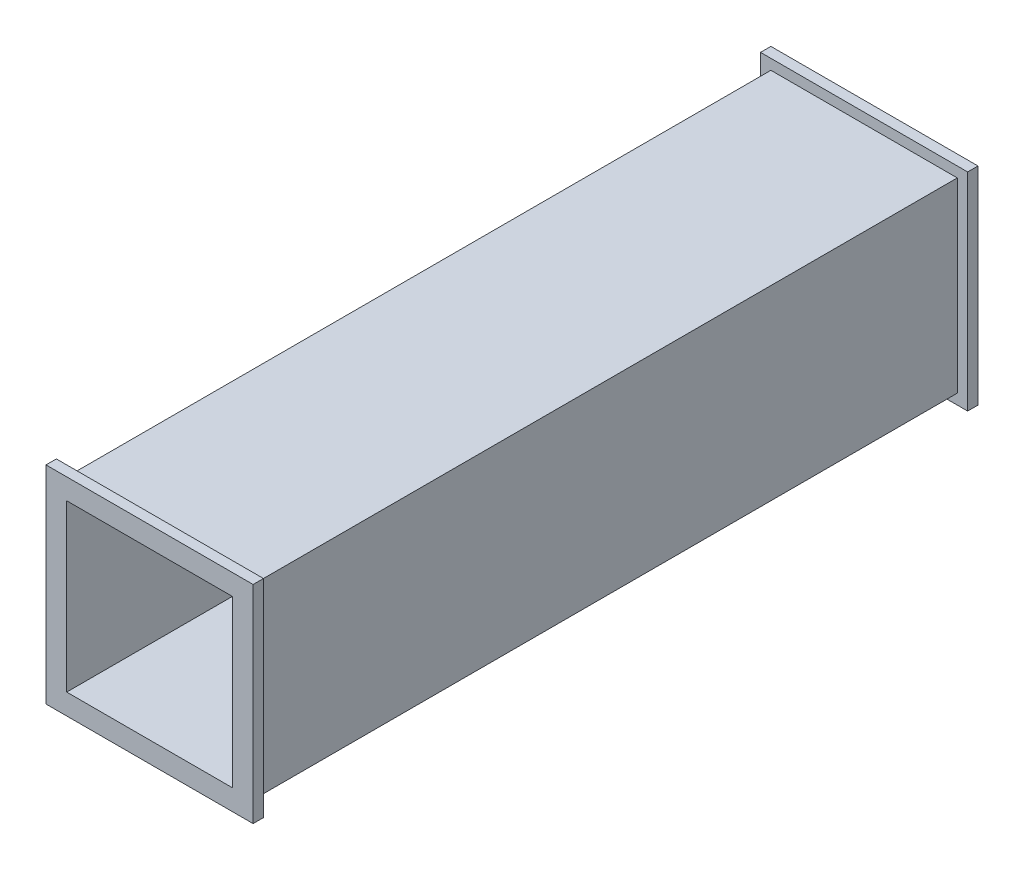
ISO-10303-21;
HEADER;
FILE_DESCRIPTION(('STEP AP214'),'2;1');
FILE_NAME('part.step','',(''),(''),'','','');
FILE_SCHEMA(('AUTOMOTIVE_DESIGN { 1 0 10303 214 1 1 1 1 }'));
ENDSEC;
DATA;
#1=APPLICATION_CONTEXT('core data for automotive mechanical design processes');
#2=APPLICATION_PROTOCOL_DEFINITION('international standard','automotive_design',2000,#1);
#3=PRODUCT_CONTEXT('',#1,'mechanical');
#4=PRODUCT('Part','Part','',(#3));
#5=PRODUCT_RELATED_PRODUCT_CATEGORY('part','',(#4));
#6=PRODUCT_DEFINITION_FORMATION('','',#4);
#7=PRODUCT_DEFINITION_CONTEXT('part definition',#1,'design');
#8=PRODUCT_DEFINITION('design','',#6,#7);
#9=PRODUCT_DEFINITION_SHAPE('','',#8);
#10=(LENGTH_UNIT() NAMED_UNIT(*) SI_UNIT(.MILLI.,.METRE.));
#11=(NAMED_UNIT(*) PLANE_ANGLE_UNIT() SI_UNIT($,.RADIAN.));
#12=(NAMED_UNIT(*) SI_UNIT($,.STERADIAN.) SOLID_ANGLE_UNIT());
#13=UNCERTAINTY_MEASURE_WITH_UNIT(LENGTH_MEASURE(1.E-05),#10,'distance_accuracy_value','');
#14=(GEOMETRIC_REPRESENTATION_CONTEXT(3) GLOBAL_UNCERTAINTY_ASSIGNED_CONTEXT((#13)) GLOBAL_UNIT_ASSIGNED_CONTEXT((#10,
#11,#12)) REPRESENTATION_CONTEXT('',''));
#15=CARTESIAN_POINT('',(0.,0.,0.));
#16=DIRECTION('',(0.,0.,1.));
#17=DIRECTION('',(1.,0.,0.));
#18=AXIS2_PLACEMENT_3D('',#15,#16,#17);
#19=CARTESIAN_POINT('',(45.,45.,350.));
#20=DIRECTION('',(-1.,0.,0.));
#21=DIRECTION('',(0.,-1.,0.));
#22=AXIS2_PLACEMENT_3D('',#19,#20,#21);
#23=PLANE('',#22);
#24=DIRECTION('',(0.,-1.,0.));
#25=VECTOR('',#24,1.);
#26=CARTESIAN_POINT('',(45.,45.,5.));
#27=LINE('',#26,#25);
#28=CARTESIAN_POINT('',(45.,45.,5.));
#29=VERTEX_POINT('',#28);
#30=CARTESIAN_POINT('',(45.,-45.,5.));
#31=VERTEX_POINT('',#30);
#32=EDGE_CURVE('E55',#29,#31,#27,.T.);
#33=ORIENTED_EDGE('',*,*,#32,.F.);
#34=DIRECTION('',(0.,0.,-1.));
#35=VECTOR('',#34,1.);
#36=CARTESIAN_POINT('',(45.,45.,350.));
#37=LINE('',#36,#35);
#38=CARTESIAN_POINT('',(45.,45.,345.));
#39=VERTEX_POINT('',#38);
#40=EDGE_CURVE('E327',#39,#29,#37,.T.);
#41=ORIENTED_EDGE('',*,*,#40,.F.);
#42=DIRECTION('',(0.,1.,0.));
#43=VECTOR('',#42,1.);
#44=CARTESIAN_POINT('',(45.,-45.,345.));
#45=LINE('',#44,#43);
#46=CARTESIAN_POINT('',(45.,-45.,345.));
#47=VERTEX_POINT('',#46);
#48=EDGE_CURVE('E234',#47,#39,#45,.T.);
#49=ORIENTED_EDGE('',*,*,#48,.F.);
#50=DIRECTION('',(0.,0.,-1.));
#51=VECTOR('',#50,1.);
#52=CARTESIAN_POINT('',(45.,-45.,350.));
#53=LINE('',#52,#51);
#54=EDGE_CURVE('E188',#47,#31,#53,.T.);
#55=ORIENTED_EDGE('',*,*,#54,.T.);
#56=EDGE_LOOP('',(#33,#41,#49,#55));
#57=FACE_BOUND('',#56,.T.);
#58=ADVANCED_FACE('F41',(#57),#23,.F.);
#59=CARTESIAN_POINT('',(-45.,45.,350.));
#60=DIRECTION('',(0.,-1.,0.));
#61=DIRECTION('',(0.,0.,-1.));
#62=AXIS2_PLACEMENT_3D('',#59,#60,#61);
#63=PLANE('',#62);
#64=DIRECTION('',(1.,0.,0.));
#65=VECTOR('',#64,1.);
#66=CARTESIAN_POINT('',(-45.,45.,5.));
#67=LINE('',#66,#65);
#68=CARTESIAN_POINT('',(-45.,45.,5.));
#69=VERTEX_POINT('',#68);
#70=EDGE_CURVE('E62',#69,#29,#67,.T.);
#71=ORIENTED_EDGE('',*,*,#70,.F.);
#72=DIRECTION('',(0.,0.,-1.));
#73=VECTOR('',#72,1.);
#74=CARTESIAN_POINT('',(-45.,45.,350.));
#75=LINE('',#74,#73);
#76=CARTESIAN_POINT('',(-45.,45.,345.));
#77=VERTEX_POINT('',#76);
#78=EDGE_CURVE('E187',#77,#69,#75,.T.);
#79=ORIENTED_EDGE('',*,*,#78,.F.);
#80=DIRECTION('',(-1.,0.,0.));
#81=VECTOR('',#80,1.);
#82=CARTESIAN_POINT('',(45.,45.,345.));
#83=LINE('',#82,#81);
#84=EDGE_CURVE('E237',#39,#77,#83,.T.);
#85=ORIENTED_EDGE('',*,*,#84,.F.);
#86=ORIENTED_EDGE('',*,*,#40,.T.);
#87=EDGE_LOOP('',(#71,#79,#85,#86));
#88=FACE_BOUND('',#87,.T.);
#89=ADVANCED_FACE('F357',(#88),#63,.F.);
#90=CARTESIAN_POINT('',(-45.,45.,350.));
#91=DIRECTION('',(1.,0.,0.));
#92=DIRECTION('',(0.,1.,0.));
#93=AXIS2_PLACEMENT_3D('',#90,#91,#92);
#94=PLANE('',#93);
#95=DIRECTION('',(0.,0.,-1.));
#96=VECTOR('',#95,1.);
#97=CARTESIAN_POINT('',(-45.,25.,125.));
#98=LINE('',#97,#96);
#99=CARTESIAN_POINT('',(-45.,25.,225.));
#100=VERTEX_POINT('',#99);
#101=CARTESIAN_POINT('',(-45.,25.,125.));
#102=VERTEX_POINT('',#101);
#103=EDGE_CURVE('E276',#100,#102,#98,.T.);
#104=ORIENTED_EDGE('',*,*,#103,.F.);
#105=DIRECTION('',(0.,1.,0.));
#106=VECTOR('',#105,1.);
#107=CARTESIAN_POINT('',(-45.,25.,225.));
#108=LINE('',#107,#106);
#109=CARTESIAN_POINT('',(-45.,-25.,225.));
#110=VERTEX_POINT('',#109);
#111=EDGE_CURVE('E269',#110,#100,#108,.T.);
#112=ORIENTED_EDGE('',*,*,#111,.F.);
#113=DIRECTION('',(0.,0.,1.));
#114=VECTOR('',#113,1.);
#115=CARTESIAN_POINT('',(-45.,-25.,125.));
#116=LINE('',#115,#114);
#117=CARTESIAN_POINT('',(-45.,-25.,125.));
#118=VERTEX_POINT('',#117);
#119=EDGE_CURVE('E282',#118,#110,#116,.T.);
#120=ORIENTED_EDGE('',*,*,#119,.F.);
#121=DIRECTION('',(0.,-1.,0.));
#122=VECTOR('',#121,1.);
#123=CARTESIAN_POINT('',(-45.,25.,125.));
#124=LINE('',#123,#122);
#125=EDGE_CURVE('E279',#102,#118,#124,.T.);
#126=ORIENTED_EDGE('',*,*,#125,.F.);
#127=EDGE_LOOP('',(#104,#112,#120,#126));
#128=FACE_BOUND('',#127,.T.);
#129=DIRECTION('',(0.,1.,0.));
#130=VECTOR('',#129,1.);
#131=CARTESIAN_POINT('',(-45.,-45.,5.));
#132=LINE('',#131,#130);
#133=CARTESIAN_POINT('',(-45.,-45.,5.));
#134=VERTEX_POINT('',#133);
#135=EDGE_CURVE('E191',#134,#69,#132,.T.);
#136=ORIENTED_EDGE('',*,*,#135,.F.);
#137=DIRECTION('',(0.,0.,-1.));
#138=VECTOR('',#137,1.);
#139=CARTESIAN_POINT('',(-45.,-45.,350.));
#140=LINE('',#139,#138);
#141=CARTESIAN_POINT('',(-45.,-45.,345.));
#142=VERTEX_POINT('',#141);
#143=EDGE_CURVE('E178',#142,#134,#140,.T.);
#144=ORIENTED_EDGE('',*,*,#143,.F.);
#145=DIRECTION('',(0.,-1.,0.));
#146=VECTOR('',#145,1.);
#147=CARTESIAN_POINT('',(-45.,45.,345.));
#148=LINE('',#147,#146);
#149=EDGE_CURVE('E240',#77,#142,#148,.T.);
#150=ORIENTED_EDGE('',*,*,#149,.F.);
#151=ORIENTED_EDGE('',*,*,#78,.T.);
#152=EDGE_LOOP('',(#136,#144,#150,#151));
#153=FACE_BOUND('',#152,.T.);
#154=ADVANCED_FACE('F192',(#128,#153),#94,.F.);
#155=CARTESIAN_POINT('',(-45.,-45.,350.));
#156=DIRECTION('',(0.,1.,0.));
#157=DIRECTION('',(0.,0.,1.));
#158=AXIS2_PLACEMENT_3D('',#155,#156,#157);
#159=PLANE('',#158);
#160=DIRECTION('',(-1.,0.,0.));
#161=VECTOR('',#160,1.);
#162=CARTESIAN_POINT('',(45.,-45.,5.));
#163=LINE('',#162,#161);
#164=EDGE_CURVE('E182',#31,#134,#163,.T.);
#165=ORIENTED_EDGE('',*,*,#164,.F.);
#166=ORIENTED_EDGE('',*,*,#54,.F.);
#167=DIRECTION('',(1.,0.,0.));
#168=VECTOR('',#167,1.);
#169=CARTESIAN_POINT('',(-45.,-45.,345.));
#170=LINE('',#169,#168);
#171=EDGE_CURVE('E184',#142,#47,#170,.T.);
#172=ORIENTED_EDGE('',*,*,#171,.F.);
#173=ORIENTED_EDGE('',*,*,#143,.T.);
#174=EDGE_LOOP('',(#165,#166,#172,#173));
#175=FACE_BOUND('',#174,.T.);
#176=ADVANCED_FACE('F180',(#175),#159,.F.);
#177=CARTESIAN_POINT('',(0.,0.,350.));
#178=DIRECTION('',(0.,0.,1.));
#179=DIRECTION('',(1.,0.,0.));
#180=AXIS2_PLACEMENT_3D('',#177,#178,#179);
#181=PLANE('',#180);
#182=DIRECTION('',(0.,1.,0.));
#183=VECTOR('',#182,1.);
#184=CARTESIAN_POINT('',(40.,45.,350.));
#185=LINE('',#184,#183);
#186=CARTESIAN_POINT('',(40.,-40.,350.));
#187=VERTEX_POINT('',#186);
#188=CARTESIAN_POINT('',(40.,40.,350.));
#189=VERTEX_POINT('',#188);
#190=EDGE_CURVE('E312',#187,#189,#185,.T.);
#191=ORIENTED_EDGE('',*,*,#190,.F.);
#192=DIRECTION('',(1.,0.,0.));
#193=VECTOR('',#192,1.);
#194=CARTESIAN_POINT('',(-45.,-40.,350.));
#195=LINE('',#194,#193);
#196=CARTESIAN_POINT('',(-40.,-40.,350.));
#197=VERTEX_POINT('',#196);
#198=EDGE_CURVE('E302',#197,#187,#195,.T.);
#199=ORIENTED_EDGE('',*,*,#198,.F.);
#200=DIRECTION('',(0.,-1.,0.));
#201=VECTOR('',#200,1.);
#202=CARTESIAN_POINT('',(-40.,45.,350.));
#203=LINE('',#202,#201);
#204=CARTESIAN_POINT('',(-40.,40.,350.));
#205=VERTEX_POINT('',#204);
#206=EDGE_CURVE('E321',#205,#197,#203,.T.);
#207=ORIENTED_EDGE('',*,*,#206,.F.);
#208=DIRECTION('',(-1.,0.,0.));
#209=VECTOR('',#208,1.);
#210=CARTESIAN_POINT('',(-45.,40.,350.));
#211=LINE('',#210,#209);
#212=EDGE_CURVE('E319',#189,#205,#211,.T.);
#213=ORIENTED_EDGE('',*,*,#212,.F.);
#214=EDGE_LOOP('',(#191,#199,#207,#213));
#215=FACE_BOUND('',#214,.T.);
#216=DIRECTION('',(0.,1.,0.));
#217=VECTOR('',#216,1.);
#218=CARTESIAN_POINT('',(50.,-50.,350.));
#219=LINE('',#218,#217);
#220=CARTESIAN_POINT('',(50.,-50.,350.));
#221=VERTEX_POINT('',#220);
#222=CARTESIAN_POINT('',(50.,50.,350.));
#223=VERTEX_POINT('',#222);
#224=EDGE_CURVE('E242',#221,#223,#219,.T.);
#225=ORIENTED_EDGE('',*,*,#224,.T.);
#226=DIRECTION('',(-1.,0.,0.));
#227=VECTOR('',#226,1.);
#228=CARTESIAN_POINT('',(50.,50.,350.));
#229=LINE('',#228,#227);
#230=CARTESIAN_POINT('',(-50.,50.,350.));
#231=VERTEX_POINT('',#230);
#232=EDGE_CURVE('E259',#223,#231,#229,.T.);
#233=ORIENTED_EDGE('',*,*,#232,.T.);
#234=DIRECTION('',(0.,-1.,0.));
#235=VECTOR('',#234,1.);
#236=CARTESIAN_POINT('',(-50.,50.,350.));
#237=LINE('',#236,#235);
#238=CARTESIAN_POINT('',(-50.,-50.,350.));
#239=VERTEX_POINT('',#238);
#240=EDGE_CURVE('E262',#231,#239,#237,.T.);
#241=ORIENTED_EDGE('',*,*,#240,.T.);
#242=DIRECTION('',(1.,0.,0.));
#243=VECTOR('',#242,1.);
#244=CARTESIAN_POINT('',(-50.,-50.,350.));
#245=LINE('',#244,#243);
#246=EDGE_CURVE('E247',#239,#221,#245,.T.);
#247=ORIENTED_EDGE('',*,*,#246,.T.);
#248=EDGE_LOOP('',(#225,#233,#241,#247));
#249=FACE_BOUND('',#248,.T.);
#250=ADVANCED_FACE('F363',(#215,#249),#181,.T.);
#251=CARTESIAN_POINT('',(0.,0.,0.));
#252=DIRECTION('',(0.,0.,1.));
#253=DIRECTION('',(1.,0.,0.));
#254=AXIS2_PLACEMENT_3D('',#251,#252,#253);
#255=PLANE('',#254);
#256=DIRECTION('',(1.,0.,0.));
#257=VECTOR('',#256,1.);
#258=CARTESIAN_POINT('',(-45.,-40.,0.));
#259=LINE('',#258,#257);
#260=CARTESIAN_POINT('',(-40.,-40.,0.));
#261=VERTEX_POINT('',#260);
#262=CARTESIAN_POINT('',(40.,-40.,0.));
#263=VERTEX_POINT('',#262);
#264=EDGE_CURVE('E309',#261,#263,#259,.T.);
#265=ORIENTED_EDGE('',*,*,#264,.T.);
#266=DIRECTION('',(0.,1.,0.));
#267=VECTOR('',#266,1.);
#268=CARTESIAN_POINT('',(40.,45.,0.));
#269=LINE('',#268,#267);
#270=CARTESIAN_POINT('',(40.,40.,0.));
#271=VERTEX_POINT('',#270);
#272=EDGE_CURVE('E288',#263,#271,#269,.T.);
#273=ORIENTED_EDGE('',*,*,#272,.T.);
#274=DIRECTION('',(-1.,0.,0.));
#275=VECTOR('',#274,1.);
#276=CARTESIAN_POINT('',(-45.,40.,0.));
#277=LINE('',#276,#275);
#278=CARTESIAN_POINT('',(-40.,40.,0.));
#279=VERTEX_POINT('',#278);
#280=EDGE_CURVE('E308',#271,#279,#277,.T.);
#281=ORIENTED_EDGE('',*,*,#280,.T.);
#282=DIRECTION('',(0.,-1.,0.));
#283=VECTOR('',#282,1.);
#284=CARTESIAN_POINT('',(-40.,45.,0.));
#285=LINE('',#284,#283);
#286=EDGE_CURVE('E313',#279,#261,#285,.T.);
#287=ORIENTED_EDGE('',*,*,#286,.T.);
#288=EDGE_LOOP('',(#265,#273,#281,#287));
#289=FACE_BOUND('',#288,.T.);
#290=DIRECTION('',(0.,1.,0.));
#291=VECTOR('',#290,1.);
#292=CARTESIAN_POINT('',(-50.,-50.,0.));
#293=LINE('',#292,#291);
#294=CARTESIAN_POINT('',(-50.,-50.,0.));
#295=VERTEX_POINT('',#294);
#296=CARTESIAN_POINT('',(-50.,50.,0.));
#297=VERTEX_POINT('',#296);
#298=EDGE_CURVE('E194',#295,#297,#293,.T.);
#299=ORIENTED_EDGE('',*,*,#298,.T.);
#300=DIRECTION('',(1.,0.,0.));
#301=VECTOR('',#300,1.);
#302=CARTESIAN_POINT('',(-50.,50.,0.));
#303=LINE('',#302,#301);
#304=CARTESIAN_POINT('',(50.,50.,0.));
#305=VERTEX_POINT('',#304);
#306=EDGE_CURVE('E218',#297,#305,#303,.T.);
#307=ORIENTED_EDGE('',*,*,#306,.T.);
#308=DIRECTION('',(0.,-1.,0.));
#309=VECTOR('',#308,1.);
#310=CARTESIAN_POINT('',(50.,50.,0.));
#311=LINE('',#310,#309);
#312=CARTESIAN_POINT('',(50.,-50.,0.));
#313=VERTEX_POINT('',#312);
#314=EDGE_CURVE('E221',#305,#313,#311,.T.);
#315=ORIENTED_EDGE('',*,*,#314,.T.);
#316=DIRECTION('',(-1.,0.,0.));
#317=VECTOR('',#316,1.);
#318=CARTESIAN_POINT('',(50.,-50.,0.));
#319=LINE('',#318,#317);
#320=EDGE_CURVE('E206',#313,#295,#319,.T.);
#321=ORIENTED_EDGE('',*,*,#320,.T.);
#322=EDGE_LOOP('',(#299,#307,#315,#321));
#323=FACE_BOUND('',#322,.T.);
#324=ADVANCED_FACE('F447',(#289,#323),#255,.F.);
#325=CARTESIAN_POINT('',(40.,45.,350.));
#326=DIRECTION('',(-1.,0.,0.));
#327=DIRECTION('',(0.,-1.,0.));
#328=AXIS2_PLACEMENT_3D('',#325,#326,#327);
#329=PLANE('',#328);
#330=ORIENTED_EDGE('',*,*,#272,.F.);
#331=DIRECTION('',(0.,0.,-1.));
#332=VECTOR('',#331,1.);
#333=CARTESIAN_POINT('',(40.,-40.,350.));
#334=LINE('',#333,#332);
#335=EDGE_CURVE('E299',#187,#263,#334,.T.);
#336=ORIENTED_EDGE('',*,*,#335,.F.);
#337=ORIENTED_EDGE('',*,*,#190,.T.);
#338=DIRECTION('',(0.,0.,-1.));
#339=VECTOR('',#338,1.);
#340=CARTESIAN_POINT('',(40.,40.,350.));
#341=LINE('',#340,#339);
#342=EDGE_CURVE('E295',#189,#271,#341,.T.);
#343=ORIENTED_EDGE('',*,*,#342,.T.);
#344=EDGE_LOOP('',(#330,#336,#337,#343));
#345=FACE_BOUND('',#344,.T.);
#346=ADVANCED_FACE('F514',(#345),#329,.T.);
#347=CARTESIAN_POINT('',(-45.,40.,350.));
#348=DIRECTION('',(0.,-1.,0.));
#349=DIRECTION('',(0.,0.,-1.));
#350=AXIS2_PLACEMENT_3D('',#347,#348,#349);
#351=PLANE('',#350);
#352=ORIENTED_EDGE('',*,*,#280,.F.);
#353=ORIENTED_EDGE('',*,*,#342,.F.);
#354=ORIENTED_EDGE('',*,*,#212,.T.);
#355=DIRECTION('',(0.,0.,-1.));
#356=VECTOR('',#355,1.);
#357=CARTESIAN_POINT('',(-40.,40.,350.));
#358=LINE('',#357,#356);
#359=EDGE_CURVE('E298',#205,#279,#358,.T.);
#360=ORIENTED_EDGE('',*,*,#359,.T.);
#361=EDGE_LOOP('',(#352,#353,#354,#360));
#362=FACE_BOUND('',#361,.T.);
#363=ADVANCED_FACE('F506',(#362),#351,.T.);
#364=CARTESIAN_POINT('',(-40.,45.,350.));
#365=DIRECTION('',(1.,0.,0.));
#366=DIRECTION('',(0.,1.,0.));
#367=AXIS2_PLACEMENT_3D('',#364,#365,#366);
#368=PLANE('',#367);
#369=DIRECTION('',(0.,-1.,0.));
#370=VECTOR('',#369,1.);
#371=CARTESIAN_POINT('',(-40.,45.,225.));
#372=LINE('',#371,#370);
#373=CARTESIAN_POINT('',(-40.,25.,225.));
#374=VERTEX_POINT('',#373);
#375=CARTESIAN_POINT('',(-40.,-25.,225.));
#376=VERTEX_POINT('',#375);
#377=EDGE_CURVE('E11',#374,#376,#372,.T.);
#378=ORIENTED_EDGE('',*,*,#377,.F.);
#379=DIRECTION('',(0.,0.,1.));
#380=VECTOR('',#379,1.);
#381=CARTESIAN_POINT('',(-40.,25.,350.));
#382=LINE('',#381,#380);
#383=CARTESIAN_POINT('',(-40.,25.,125.));
#384=VERTEX_POINT('',#383);
#385=EDGE_CURVE('E329',#384,#374,#382,.T.);
#386=ORIENTED_EDGE('',*,*,#385,.F.);
#387=DIRECTION('',(0.,1.,0.));
#388=VECTOR('',#387,1.);
#389=CARTESIAN_POINT('',(-40.,45.,125.));
#390=LINE('',#389,#388);
#391=CARTESIAN_POINT('',(-40.,-25.,125.));
#392=VERTEX_POINT('',#391);
#393=EDGE_CURVE('E331',#392,#384,#390,.T.);
#394=ORIENTED_EDGE('',*,*,#393,.F.);
#395=DIRECTION('',(0.,0.,-1.));
#396=VECTOR('',#395,1.);
#397=CARTESIAN_POINT('',(-40.,-25.,350.));
#398=LINE('',#397,#396);
#399=EDGE_CURVE('E48',#376,#392,#398,.T.);
#400=ORIENTED_EDGE('',*,*,#399,.F.);
#401=EDGE_LOOP('',(#378,#386,#394,#400));
#402=FACE_BOUND('',#401,.T.);
#403=ORIENTED_EDGE('',*,*,#286,.F.);
#404=ORIENTED_EDGE('',*,*,#359,.F.);
#405=ORIENTED_EDGE('',*,*,#206,.T.);
#406=DIRECTION('',(0.,0.,-1.));
#407=VECTOR('',#406,1.);
#408=CARTESIAN_POINT('',(-40.,-40.,350.));
#409=LINE('',#408,#407);
#410=EDGE_CURVE('E301',#197,#261,#409,.T.);
#411=ORIENTED_EDGE('',*,*,#410,.T.);
#412=EDGE_LOOP('',(#403,#404,#405,#411));
#413=FACE_BOUND('',#412,.T.);
#414=ADVANCED_FACE('F346',(#402,#413),#368,.T.);
#415=CARTESIAN_POINT('',(-45.,-40.,350.));
#416=DIRECTION('',(0.,1.,0.));
#417=DIRECTION('',(0.,0.,1.));
#418=AXIS2_PLACEMENT_3D('',#415,#416,#417);
#419=PLANE('',#418);
#420=ORIENTED_EDGE('',*,*,#264,.F.);
#421=ORIENTED_EDGE('',*,*,#410,.F.);
#422=ORIENTED_EDGE('',*,*,#198,.T.);
#423=ORIENTED_EDGE('',*,*,#335,.T.);
#424=EDGE_LOOP('',(#420,#421,#422,#423));
#425=FACE_BOUND('',#424,.T.);
#426=ADVANCED_FACE('F487',(#425),#419,.T.);
#427=CARTESIAN_POINT('',(-25.,25.,225.));
#428=DIRECTION('',(0.,0.,1.));
#429=DIRECTION('',(1.,0.,0.));
#430=AXIS2_PLACEMENT_3D('',#427,#428,#429);
#431=PLANE('',#430);
#432=ORIENTED_EDGE('',*,*,#377,.T.);
#433=DIRECTION('',(-1.,0.,0.));
#434=VECTOR('',#433,1.);
#435=CARTESIAN_POINT('',(-25.,-25.,225.));
#436=LINE('',#435,#434);
#437=EDGE_CURVE('E286',#376,#110,#436,.T.);
#438=ORIENTED_EDGE('',*,*,#437,.T.);
#439=ORIENTED_EDGE('',*,*,#111,.T.);
#440=DIRECTION('',(-1.,0.,0.));
#441=VECTOR('',#440,1.);
#442=CARTESIAN_POINT('',(-25.,25.,225.));
#443=LINE('',#442,#441);
#444=EDGE_CURVE('E285',#374,#100,#443,.T.);
#445=ORIENTED_EDGE('',*,*,#444,.F.);
#446=EDGE_LOOP('',(#432,#438,#439,#445));
#447=FACE_BOUND('',#446,.T.);
#448=ADVANCED_FACE('F353',(#447),#431,.F.);
#449=CARTESIAN_POINT('',(-25.,-25.,125.));
#450=DIRECTION('',(0.,-1.,0.));
#451=DIRECTION('',(1.,0.,0.));
#452=AXIS2_PLACEMENT_3D('',#449,#450,#451);
#453=PLANE('',#452);
#454=ORIENTED_EDGE('',*,*,#399,.T.);
#455=DIRECTION('',(-1.,0.,0.));
#456=VECTOR('',#455,1.);
#457=CARTESIAN_POINT('',(-25.,-25.,125.));
#458=LINE('',#457,#456);
#459=EDGE_CURVE('E289',#392,#118,#458,.T.);
#460=ORIENTED_EDGE('',*,*,#459,.T.);
#461=ORIENTED_EDGE('',*,*,#119,.T.);
#462=ORIENTED_EDGE('',*,*,#437,.F.);
#463=EDGE_LOOP('',(#454,#460,#461,#462));
#464=FACE_BOUND('',#463,.T.);
#465=ADVANCED_FACE('F337',(#464),#453,.F.);
#466=CARTESIAN_POINT('',(-25.,25.,125.));
#467=DIRECTION('',(0.,0.,-1.));
#468=DIRECTION('',(-1.,0.,0.));
#469=AXIS2_PLACEMENT_3D('',#466,#467,#468);
#470=PLANE('',#469);
#471=ORIENTED_EDGE('',*,*,#393,.T.);
#472=DIRECTION('',(-1.,0.,0.));
#473=VECTOR('',#472,1.);
#474=CARTESIAN_POINT('',(-25.,25.,125.));
#475=LINE('',#474,#473);
#476=EDGE_CURVE('E291',#384,#102,#475,.T.);
#477=ORIENTED_EDGE('',*,*,#476,.T.);
#478=ORIENTED_EDGE('',*,*,#125,.T.);
#479=ORIENTED_EDGE('',*,*,#459,.F.);
#480=EDGE_LOOP('',(#471,#477,#478,#479));
#481=FACE_BOUND('',#480,.T.);
#482=ADVANCED_FACE('F342',(#481),#470,.F.);
#483=CARTESIAN_POINT('',(-25.,25.,125.));
#484=DIRECTION('',(0.,1.,0.));
#485=DIRECTION('',(-1.,0.,0.));
#486=AXIS2_PLACEMENT_3D('',#483,#484,#485);
#487=PLANE('',#486);
#488=ORIENTED_EDGE('',*,*,#385,.T.);
#489=ORIENTED_EDGE('',*,*,#444,.T.);
#490=ORIENTED_EDGE('',*,*,#103,.T.);
#491=ORIENTED_EDGE('',*,*,#476,.F.);
#492=EDGE_LOOP('',(#488,#489,#490,#491));
#493=FACE_BOUND('',#492,.T.);
#494=ADVANCED_FACE('F350',(#493),#487,.F.);
#495=CARTESIAN_POINT('',(50.,-50.,345.));
#496=DIRECTION('',(1.,0.,0.));
#497=DIRECTION('',(0.,0.,-1.));
#498=AXIS2_PLACEMENT_3D('',#495,#496,#497);
#499=PLANE('',#498);
#500=ORIENTED_EDGE('',*,*,#224,.F.);
#501=DIRECTION('',(0.,0.,1.));
#502=VECTOR('',#501,1.);
#503=CARTESIAN_POINT('',(50.,-50.,345.));
#504=LINE('',#503,#502);
#505=CARTESIAN_POINT('',(50.,-50.,345.));
#506=VERTEX_POINT('',#505);
#507=EDGE_CURVE('E267',#506,#221,#504,.T.);
#508=ORIENTED_EDGE('',*,*,#507,.F.);
#509=DIRECTION('',(0.,1.,0.));
#510=VECTOR('',#509,1.);
#511=CARTESIAN_POINT('',(50.,-50.,345.));
#512=LINE('',#511,#510);
#513=CARTESIAN_POINT('',(50.,50.,345.));
#514=VERTEX_POINT('',#513);
#515=EDGE_CURVE('E243',#506,#514,#512,.T.);
#516=ORIENTED_EDGE('',*,*,#515,.T.);
#517=DIRECTION('',(0.,0.,1.));
#518=VECTOR('',#517,1.);
#519=CARTESIAN_POINT('',(50.,50.,345.));
#520=LINE('',#519,#518);
#521=EDGE_CURVE('E256',#514,#223,#520,.T.);
#522=ORIENTED_EDGE('',*,*,#521,.T.);
#523=EDGE_LOOP('',(#500,#508,#516,#522));
#524=FACE_BOUND('',#523,.T.);
#525=ADVANCED_FACE('F427',(#524),#499,.T.);
#526=CARTESIAN_POINT('',(-50.,-50.,345.));
#527=DIRECTION('',(0.,-1.,0.));
#528=DIRECTION('',(0.,0.,-1.));
#529=AXIS2_PLACEMENT_3D('',#526,#527,#528);
#530=PLANE('',#529);
#531=ORIENTED_EDGE('',*,*,#246,.F.);
#532=DIRECTION('',(0.,0.,1.));
#533=VECTOR('',#532,1.);
#534=CARTESIAN_POINT('',(-50.,-50.,345.));
#535=LINE('',#534,#533);
#536=CARTESIAN_POINT('',(-50.,-50.,345.));
#537=VERTEX_POINT('',#536);
#538=EDGE_CURVE('E270',#537,#239,#535,.T.);
#539=ORIENTED_EDGE('',*,*,#538,.F.);
#540=DIRECTION('',(1.,0.,0.));
#541=VECTOR('',#540,1.);
#542=CARTESIAN_POINT('',(-50.,-50.,345.));
#543=LINE('',#542,#541);
#544=EDGE_CURVE('E253',#537,#506,#543,.T.);
#545=ORIENTED_EDGE('',*,*,#544,.T.);
#546=ORIENTED_EDGE('',*,*,#507,.T.);
#547=EDGE_LOOP('',(#531,#539,#545,#546));
#548=FACE_BOUND('',#547,.T.);
#549=ADVANCED_FACE('F417',(#548),#530,.T.);
#550=CARTESIAN_POINT('',(-50.,50.,345.));
#551=DIRECTION('',(-1.,0.,0.));
#552=DIRECTION('',(0.,0.,1.));
#553=AXIS2_PLACEMENT_3D('',#550,#551,#552);
#554=PLANE('',#553);
#555=ORIENTED_EDGE('',*,*,#240,.F.);
#556=DIRECTION('',(0.,0.,1.));
#557=VECTOR('',#556,1.);
#558=CARTESIAN_POINT('',(-50.,50.,345.));
#559=LINE('',#558,#557);
#560=CARTESIAN_POINT('',(-50.,50.,345.));
#561=VERTEX_POINT('',#560);
#562=EDGE_CURVE('E272',#561,#231,#559,.T.);
#563=ORIENTED_EDGE('',*,*,#562,.F.);
#564=DIRECTION('',(0.,-1.,0.));
#565=VECTOR('',#564,1.);
#566=CARTESIAN_POINT('',(-50.,50.,345.));
#567=LINE('',#566,#565);
#568=EDGE_CURVE('E250',#561,#537,#567,.T.);
#569=ORIENTED_EDGE('',*,*,#568,.T.);
#570=ORIENTED_EDGE('',*,*,#538,.T.);
#571=EDGE_LOOP('',(#555,#563,#569,#570));
#572=FACE_BOUND('',#571,.T.);
#573=ADVANCED_FACE('F407',(#572),#554,.T.);
#574=CARTESIAN_POINT('',(50.,50.,345.));
#575=DIRECTION('',(0.,1.,0.));
#576=DIRECTION('',(0.,0.,1.));
#577=AXIS2_PLACEMENT_3D('',#574,#575,#576);
#578=PLANE('',#577);
#579=ORIENTED_EDGE('',*,*,#232,.F.);
#580=ORIENTED_EDGE('',*,*,#521,.F.);
#581=DIRECTION('',(-1.,0.,0.));
#582=VECTOR('',#581,1.);
#583=CARTESIAN_POINT('',(50.,50.,345.));
#584=LINE('',#583,#582);
#585=EDGE_CURVE('E246',#514,#561,#584,.T.);
#586=ORIENTED_EDGE('',*,*,#585,.T.);
#587=ORIENTED_EDGE('',*,*,#562,.T.);
#588=EDGE_LOOP('',(#579,#580,#586,#587));
#589=FACE_BOUND('',#588,.T.);
#590=ADVANCED_FACE('F399',(#589),#578,.T.);
#591=CARTESIAN_POINT('',(0.,0.,345.));
#592=DIRECTION('',(0.,0.,1.));
#593=DIRECTION('',(1.,0.,0.));
#594=AXIS2_PLACEMENT_3D('',#591,#592,#593);
#595=PLANE('',#594);
#596=ORIENTED_EDGE('',*,*,#149,.T.);
#597=ORIENTED_EDGE('',*,*,#171,.T.);
#598=ORIENTED_EDGE('',*,*,#48,.T.);
#599=ORIENTED_EDGE('',*,*,#84,.T.);
#600=EDGE_LOOP('',(#596,#597,#598,#599));
#601=FACE_BOUND('',#600,.T.);
#602=ORIENTED_EDGE('',*,*,#515,.F.);
#603=ORIENTED_EDGE('',*,*,#544,.F.);
#604=ORIENTED_EDGE('',*,*,#568,.F.);
#605=ORIENTED_EDGE('',*,*,#585,.F.);
#606=EDGE_LOOP('',(#602,#603,#604,#605));
#607=FACE_BOUND('',#606,.T.);
#608=ADVANCED_FACE('F374',(#601,#607),#595,.F.);
#609=CARTESIAN_POINT('',(-50.,-50.,5.));
#610=DIRECTION('',(-1.,0.,0.));
#611=DIRECTION('',(0.,0.,1.));
#612=AXIS2_PLACEMENT_3D('',#609,#610,#611);
#613=PLANE('',#612);
#614=ORIENTED_EDGE('',*,*,#298,.F.);
#615=DIRECTION('',(0.,0.,-1.));
#616=VECTOR('',#615,1.);
#617=CARTESIAN_POINT('',(-50.,-50.,5.));
#618=LINE('',#617,#616);
#619=CARTESIAN_POINT('',(-50.,-50.,5.));
#620=VERTEX_POINT('',#619);
#621=EDGE_CURVE('E226',#620,#295,#618,.T.);
#622=ORIENTED_EDGE('',*,*,#621,.F.);
#623=DIRECTION('',(0.,1.,0.));
#624=VECTOR('',#623,1.);
#625=CARTESIAN_POINT('',(-50.,-50.,5.));
#626=LINE('',#625,#624);
#627=CARTESIAN_POINT('',(-50.,50.,5.));
#628=VERTEX_POINT('',#627);
#629=EDGE_CURVE('E202',#620,#628,#626,.T.);
#630=ORIENTED_EDGE('',*,*,#629,.T.);
#631=DIRECTION('',(0.,0.,-1.));
#632=VECTOR('',#631,1.);
#633=CARTESIAN_POINT('',(-50.,50.,5.));
#634=LINE('',#633,#632);
#635=EDGE_CURVE('E215',#628,#297,#634,.T.);
#636=ORIENTED_EDGE('',*,*,#635,.T.);
#637=EDGE_LOOP('',(#614,#622,#630,#636));
#638=FACE_BOUND('',#637,.T.);
#639=ADVANCED_FACE('F398',(#638),#613,.T.);
#640=CARTESIAN_POINT('',(50.,-50.,5.));
#641=DIRECTION('',(0.,-1.,0.));
#642=DIRECTION('',(0.,0.,-1.));
#643=AXIS2_PLACEMENT_3D('',#640,#641,#642);
#644=PLANE('',#643);
#645=ORIENTED_EDGE('',*,*,#320,.F.);
#646=DIRECTION('',(0.,0.,-1.));
#647=VECTOR('',#646,1.);
#648=CARTESIAN_POINT('',(50.,-50.,5.));
#649=LINE('',#648,#647);
#650=CARTESIAN_POINT('',(50.,-50.,5.));
#651=VERTEX_POINT('',#650);
#652=EDGE_CURVE('E228',#651,#313,#649,.T.);
#653=ORIENTED_EDGE('',*,*,#652,.F.);
#654=DIRECTION('',(-1.,0.,0.));
#655=VECTOR('',#654,1.);
#656=CARTESIAN_POINT('',(50.,-50.,5.));
#657=LINE('',#656,#655);
#658=EDGE_CURVE('E212',#651,#620,#657,.T.);
#659=ORIENTED_EDGE('',*,*,#658,.T.);
#660=ORIENTED_EDGE('',*,*,#621,.T.);
#661=EDGE_LOOP('',(#645,#653,#659,#660));
#662=FACE_BOUND('',#661,.T.);
#663=ADVANCED_FACE('F543',(#662),#644,.T.);
#664=CARTESIAN_POINT('',(50.,50.,5.));
#665=DIRECTION('',(1.,0.,0.));
#666=DIRECTION('',(0.,0.,-1.));
#667=AXIS2_PLACEMENT_3D('',#664,#665,#666);
#668=PLANE('',#667);
#669=ORIENTED_EDGE('',*,*,#314,.F.);
#670=DIRECTION('',(0.,0.,-1.));
#671=VECTOR('',#670,1.);
#672=CARTESIAN_POINT('',(50.,50.,5.));
#673=LINE('',#672,#671);
#674=CARTESIAN_POINT('',(50.,50.,5.));
#675=VERTEX_POINT('',#674);
#676=EDGE_CURVE('E230',#675,#305,#673,.T.);
#677=ORIENTED_EDGE('',*,*,#676,.F.);
#678=DIRECTION('',(0.,-1.,0.));
#679=VECTOR('',#678,1.);
#680=CARTESIAN_POINT('',(50.,50.,5.));
#681=LINE('',#680,#679);
#682=EDGE_CURVE('E209',#675,#651,#681,.T.);
#683=ORIENTED_EDGE('',*,*,#682,.T.);
#684=ORIENTED_EDGE('',*,*,#652,.T.);
#685=EDGE_LOOP('',(#669,#677,#683,#684));
#686=FACE_BOUND('',#685,.T.);
#687=ADVANCED_FACE('F553',(#686),#668,.T.);
#688=CARTESIAN_POINT('',(-50.,50.,5.));
#689=DIRECTION('',(0.,1.,0.));
#690=DIRECTION('',(0.,0.,1.));
#691=AXIS2_PLACEMENT_3D('',#688,#689,#690);
#692=PLANE('',#691);
#693=ORIENTED_EDGE('',*,*,#306,.F.);
#694=ORIENTED_EDGE('',*,*,#635,.F.);
#695=DIRECTION('',(1.,0.,0.));
#696=VECTOR('',#695,1.);
#697=CARTESIAN_POINT('',(-50.,50.,5.));
#698=LINE('',#697,#696);
#699=EDGE_CURVE('E205',#628,#675,#698,.T.);
#700=ORIENTED_EDGE('',*,*,#699,.T.);
#701=ORIENTED_EDGE('',*,*,#676,.T.);
#702=EDGE_LOOP('',(#693,#694,#700,#701));
#703=FACE_BOUND('',#702,.T.);
#704=ADVANCED_FACE('F563',(#703),#692,.T.);
#705=CARTESIAN_POINT('',(0.,0.,5.));
#706=DIRECTION('',(0.,0.,-1.));
#707=DIRECTION('',(-1.,0.,0.));
#708=AXIS2_PLACEMENT_3D('',#705,#706,#707);
#709=PLANE('',#708);
#710=ORIENTED_EDGE('',*,*,#135,.T.);
#711=ORIENTED_EDGE('',*,*,#70,.T.);
#712=ORIENTED_EDGE('',*,*,#32,.T.);
#713=ORIENTED_EDGE('',*,*,#164,.T.);
#714=EDGE_LOOP('',(#710,#711,#712,#713));
#715=FACE_BOUND('',#714,.T.);
#716=ORIENTED_EDGE('',*,*,#629,.F.);
#717=ORIENTED_EDGE('',*,*,#658,.F.);
#718=ORIENTED_EDGE('',*,*,#682,.F.);
#719=ORIENTED_EDGE('',*,*,#699,.F.);
#720=EDGE_LOOP('',(#716,#717,#718,#719));
#721=FACE_BOUND('',#720,.T.);
#722=ADVANCED_FACE('F196',(#715,#721),#709,.F.);
#723=CLOSED_SHELL('',(#58,#89,#154,#176,#250,#324,#346,#363,#414,#426,#448,#465,#482,#494,#525,
#549,#573,#590,#608,#639,#663,#687,#704,#722));
#724=MANIFOLD_SOLID_BREP('B2',#723);
#725=ADVANCED_BREP_SHAPE_REPRESENTATION('',(#18,#724),#14);
#726=SHAPE_DEFINITION_REPRESENTATION(#9,#725);
ENDSEC;
END-ISO-10303-21;
